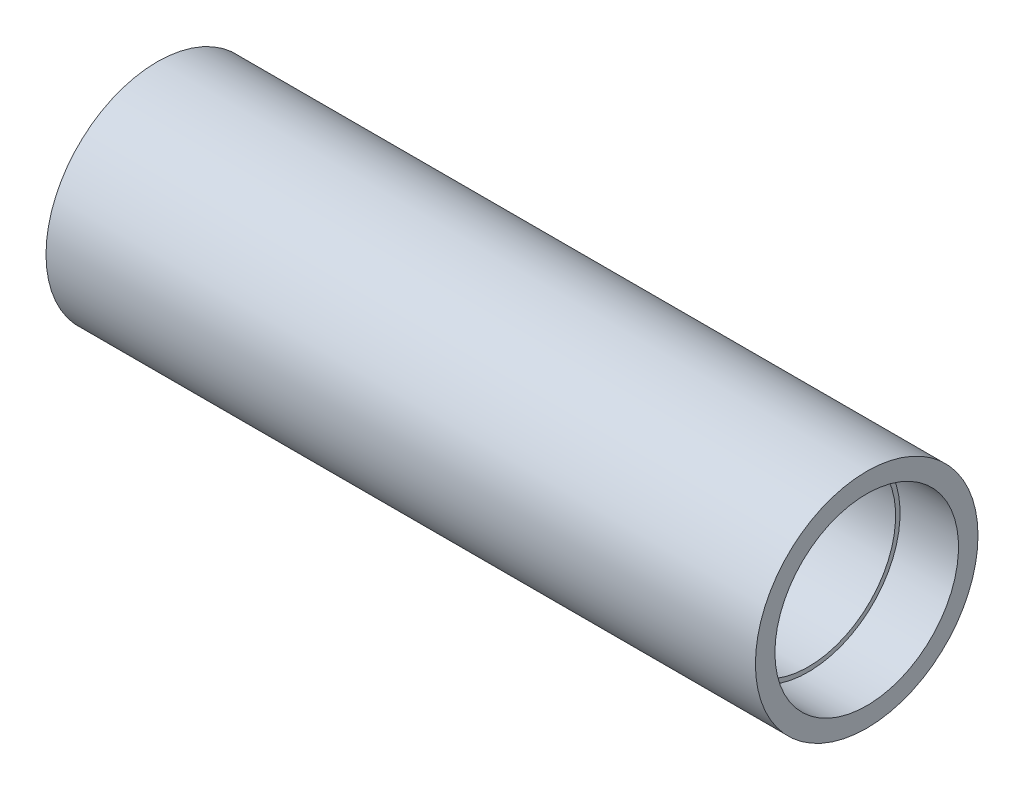
ISO-10303-21;
HEADER;
FILE_DESCRIPTION(('STEP AP214'),'2;1');
FILE_NAME('part.step','',(''),(''),'','','');
FILE_SCHEMA(('AUTOMOTIVE_DESIGN { 1 0 10303 214 1 1 1 1 }'));
ENDSEC;
DATA;
#1=APPLICATION_CONTEXT('core data for automotive mechanical design processes');
#2=APPLICATION_PROTOCOL_DEFINITION('international standard','automotive_design',2000,#1);
#3=PRODUCT_CONTEXT('',#1,'mechanical');
#4=PRODUCT('Part','Part','',(#3));
#5=PRODUCT_RELATED_PRODUCT_CATEGORY('part','',(#4));
#6=PRODUCT_DEFINITION_FORMATION('','',#4);
#7=PRODUCT_DEFINITION_CONTEXT('part definition',#1,'design');
#8=PRODUCT_DEFINITION('design','',#6,#7);
#9=PRODUCT_DEFINITION_SHAPE('','',#8);
#10=(LENGTH_UNIT() NAMED_UNIT(*) SI_UNIT(.MILLI.,.METRE.));
#11=(NAMED_UNIT(*) PLANE_ANGLE_UNIT() SI_UNIT($,.RADIAN.));
#12=(NAMED_UNIT(*) SI_UNIT($,.STERADIAN.) SOLID_ANGLE_UNIT());
#13=UNCERTAINTY_MEASURE_WITH_UNIT(LENGTH_MEASURE(1.E-05),#10,'distance_accuracy_value','');
#14=(GEOMETRIC_REPRESENTATION_CONTEXT(3) GLOBAL_UNCERTAINTY_ASSIGNED_CONTEXT((#13)) GLOBAL_UNIT_ASSIGNED_CONTEXT((#10,
#11,#12)) REPRESENTATION_CONTEXT('',''));
#15=CARTESIAN_POINT('',(0.,0.,0.));
#16=DIRECTION('',(0.,0.,1.));
#17=DIRECTION('',(1.,0.,0.));
#18=AXIS2_PLACEMENT_3D('',#15,#16,#17);
#19=CARTESIAN_POINT('',(42.5,0.,-13.335));
#20=DIRECTION('',(-1.,0.,0.));
#21=DIRECTION('',(0.,0.,1.));
#22=AXIS2_PLACEMENT_3D('',#19,#20,#21);
#23=PLANE('',#22);
#24=CARTESIAN_POINT('',(42.5,0.,0.));
#25=DIRECTION('',(-1.,0.,0.));
#26=DIRECTION('',(0.,0.,1.));
#27=AXIS2_PLACEMENT_3D('',#24,#25,#26);
#28=CIRCLE('',#27,13.335);
#29=CARTESIAN_POINT('',(42.5,0.,13.335));
#30=VERTEX_POINT('',#29);
#31=EDGE_CURVE('E59',#30,#30,#28,.T.);
#32=ORIENTED_EDGE('',*,*,#31,.F.);
#33=EDGE_LOOP('',(#32));
#34=FACE_BOUND('',#33,.T.);
#35=CARTESIAN_POINT('',(42.5,0.,0.));
#36=DIRECTION('',(-1.,0.,0.));
#37=DIRECTION('',(0.,0.,1.));
#38=AXIS2_PLACEMENT_3D('',#35,#36,#37);
#39=CIRCLE('',#38,11.);
#40=CARTESIAN_POINT('',(42.5,0.,11.));
#41=VERTEX_POINT('',#40);
#42=EDGE_CURVE('E10',#41,#41,#39,.T.);
#43=ORIENTED_EDGE('',*,*,#42,.T.);
#44=EDGE_LOOP('',(#43));
#45=FACE_BOUND('',#44,.T.);
#46=ADVANCED_FACE('F31',(#34,#45),#23,.F.);
#47=CARTESIAN_POINT('',(-42.5,0.,0.));
#48=DIRECTION('',(-1.,0.,0.));
#49=DIRECTION('',(0.,0.,1.));
#50=AXIS2_PLACEMENT_3D('',#47,#48,#49);
#51=CYLINDRICAL_SURFACE('',#50,11.);
#52=ORIENTED_EDGE('',*,*,#42,.F.);
#53=EDGE_LOOP('',(#52));
#54=FACE_BOUND('',#53,.T.);
#55=CARTESIAN_POINT('',(35.5,0.,0.));
#56=DIRECTION('',(-1.,0.,0.));
#57=DIRECTION('',(0.,0.,1.));
#58=AXIS2_PLACEMENT_3D('',#55,#56,#57);
#59=CIRCLE('',#58,11.);
#60=CARTESIAN_POINT('',(35.5,0.,11.));
#61=VERTEX_POINT('',#60);
#62=EDGE_CURVE('E37',#61,#61,#59,.T.);
#63=ORIENTED_EDGE('',*,*,#62,.T.);
#64=EDGE_LOOP('',(#63));
#65=FACE_BOUND('',#64,.T.);
#66=ADVANCED_FACE('F66',(#54,#65),#51,.F.);
#67=CARTESIAN_POINT('',(35.5,0.,-11.));
#68=DIRECTION('',(-1.,0.,0.));
#69=DIRECTION('',(0.,0.,1.));
#70=AXIS2_PLACEMENT_3D('',#67,#68,#69);
#71=PLANE('',#70);
#72=ORIENTED_EDGE('',*,*,#62,.F.);
#73=EDGE_LOOP('',(#72));
#74=FACE_BOUND('',#73,.T.);
#75=CARTESIAN_POINT('',(35.5,0.,0.));
#76=DIRECTION('',(-1.,0.,0.));
#77=DIRECTION('',(0.,0.,1.));
#78=AXIS2_PLACEMENT_3D('',#75,#76,#77);
#79=CIRCLE('',#78,10.4648);
#80=CARTESIAN_POINT('',(35.5,0.,10.4648));
#81=VERTEX_POINT('',#80);
#82=EDGE_CURVE('E41',#81,#81,#79,.T.);
#83=ORIENTED_EDGE('',*,*,#82,.T.);
#84=EDGE_LOOP('',(#83));
#85=FACE_BOUND('',#84,.T.);
#86=ADVANCED_FACE('F70',(#74,#85),#71,.F.);
#87=CARTESIAN_POINT('',(-42.5,0.,0.));
#88=DIRECTION('',(-1.,0.,0.));
#89=DIRECTION('',(0.,0.,1.));
#90=AXIS2_PLACEMENT_3D('',#87,#88,#89);
#91=CYLINDRICAL_SURFACE('',#90,10.4648);
#92=ORIENTED_EDGE('',*,*,#82,.F.);
#93=EDGE_LOOP('',(#92));
#94=FACE_BOUND('',#93,.T.);
#95=CARTESIAN_POINT('',(-35.5,0.,0.));
#96=DIRECTION('',(-1.,0.,0.));
#97=DIRECTION('',(0.,0.,1.));
#98=AXIS2_PLACEMENT_3D('',#95,#96,#97);
#99=CIRCLE('',#98,10.4648);
#100=CARTESIAN_POINT('',(-35.5,0.,10.4648));
#101=VERTEX_POINT('',#100);
#102=EDGE_CURVE('E45',#101,#101,#99,.T.);
#103=ORIENTED_EDGE('',*,*,#102,.T.);
#104=EDGE_LOOP('',(#103));
#105=FACE_BOUND('',#104,.T.);
#106=ADVANCED_FACE('F75',(#94,#105),#91,.F.);
#107=CARTESIAN_POINT('',(-35.5,0.,-11.));
#108=DIRECTION('',(1.,0.,0.));
#109=DIRECTION('',(0.,0.,-1.));
#110=AXIS2_PLACEMENT_3D('',#107,#108,#109);
#111=PLANE('',#110);
#112=ORIENTED_EDGE('',*,*,#102,.F.);
#113=EDGE_LOOP('',(#112));
#114=FACE_BOUND('',#113,.T.);
#115=CARTESIAN_POINT('',(-35.5,0.,0.));
#116=DIRECTION('',(-1.,0.,0.));
#117=DIRECTION('',(0.,0.,1.));
#118=AXIS2_PLACEMENT_3D('',#115,#116,#117);
#119=CIRCLE('',#118,11.);
#120=CARTESIAN_POINT('',(-35.5,0.,11.));
#121=VERTEX_POINT('',#120);
#122=EDGE_CURVE('E50',#121,#121,#119,.T.);
#123=ORIENTED_EDGE('',*,*,#122,.T.);
#124=EDGE_LOOP('',(#123));
#125=FACE_BOUND('',#124,.T.);
#126=ADVANCED_FACE('F81',(#114,#125),#111,.F.);
#127=CARTESIAN_POINT('',(-42.5,0.,0.));
#128=DIRECTION('',(-1.,0.,0.));
#129=DIRECTION('',(0.,0.,1.));
#130=AXIS2_PLACEMENT_3D('',#127,#128,#129);
#131=CYLINDRICAL_SURFACE('',#130,11.);
#132=ORIENTED_EDGE('',*,*,#122,.F.);
#133=EDGE_LOOP('',(#132));
#134=FACE_BOUND('',#133,.T.);
#135=CARTESIAN_POINT('',(-42.5,0.,0.));
#136=DIRECTION('',(-1.,0.,0.));
#137=DIRECTION('',(0.,0.,1.));
#138=AXIS2_PLACEMENT_3D('',#135,#136,#137);
#139=CIRCLE('',#138,11.);
#140=CARTESIAN_POINT('',(-42.5,0.,11.));
#141=VERTEX_POINT('',#140);
#142=EDGE_CURVE('E53',#141,#141,#139,.T.);
#143=ORIENTED_EDGE('',*,*,#142,.T.);
#144=EDGE_LOOP('',(#143));
#145=FACE_BOUND('',#144,.T.);
#146=ADVANCED_FACE('F85',(#134,#145),#131,.F.);
#147=CARTESIAN_POINT('',(-42.5,0.,-13.335));
#148=DIRECTION('',(1.,0.,0.));
#149=DIRECTION('',(0.,0.,-1.));
#150=AXIS2_PLACEMENT_3D('',#147,#148,#149);
#151=PLANE('',#150);
#152=ORIENTED_EDGE('',*,*,#142,.F.);
#153=EDGE_LOOP('',(#152));
#154=FACE_BOUND('',#153,.T.);
#155=CARTESIAN_POINT('',(-42.5,0.,0.));
#156=DIRECTION('',(-1.,0.,0.));
#157=DIRECTION('',(0.,0.,1.));
#158=AXIS2_PLACEMENT_3D('',#155,#156,#157);
#159=CIRCLE('',#158,13.335);
#160=CARTESIAN_POINT('',(-42.5,0.,13.335));
#161=VERTEX_POINT('',#160);
#162=EDGE_CURVE('E56',#161,#161,#159,.T.);
#163=ORIENTED_EDGE('',*,*,#162,.T.);
#164=EDGE_LOOP('',(#163));
#165=FACE_BOUND('',#164,.T.);
#166=ADVANCED_FACE('F89',(#154,#165),#151,.F.);
#167=CARTESIAN_POINT('',(-42.5,0.,0.));
#168=DIRECTION('',(-1.,0.,0.));
#169=DIRECTION('',(0.,0.,1.));
#170=AXIS2_PLACEMENT_3D('',#167,#168,#169);
#171=CYLINDRICAL_SURFACE('',#170,13.335);
#172=ORIENTED_EDGE('',*,*,#162,.F.);
#173=EDGE_LOOP('',(#172));
#174=FACE_BOUND('',#173,.T.);
#175=ORIENTED_EDGE('',*,*,#31,.T.);
#176=EDGE_LOOP('',(#175));
#177=FACE_BOUND('',#176,.T.);
#178=ADVANCED_FACE('F63',(#174,#177),#171,.T.);
#179=CLOSED_SHELL('',(#46,#66,#86,#106,#126,#146,#166,#178));
#180=MANIFOLD_SOLID_BREP('B2',#179);
#181=ADVANCED_BREP_SHAPE_REPRESENTATION('',(#18,#180),#14);
#182=SHAPE_DEFINITION_REPRESENTATION(#9,#181);
ENDSEC;
END-ISO-10303-21;
